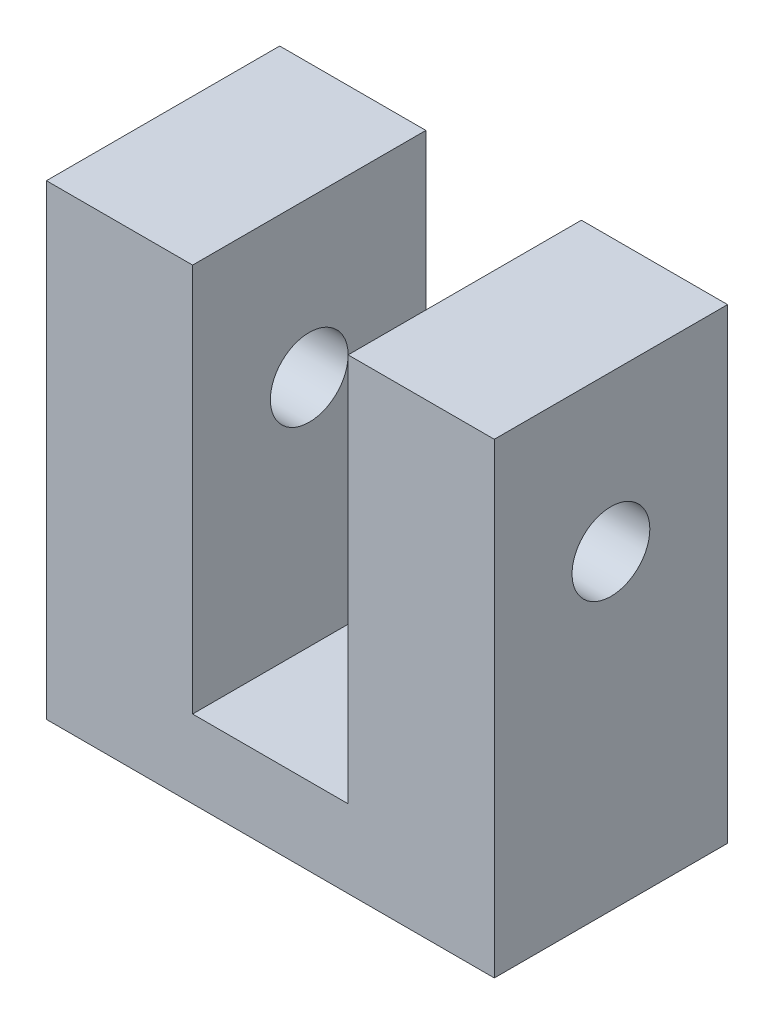
ISO-10303-21;
HEADER;
FILE_DESCRIPTION(('STEP AP214'),'2;1');
FILE_NAME('part.step','',(''),(''),'','','');
FILE_SCHEMA(('AUTOMOTIVE_DESIGN { 1 0 10303 214 1 1 1 1 }'));
ENDSEC;
DATA;
#1=APPLICATION_CONTEXT('core data for automotive mechanical design processes');
#2=APPLICATION_PROTOCOL_DEFINITION('international standard','automotive_design',2000,#1);
#3=PRODUCT_CONTEXT('',#1,'mechanical');
#4=PRODUCT('Part','Part','',(#3));
#5=PRODUCT_RELATED_PRODUCT_CATEGORY('part','',(#4));
#6=PRODUCT_DEFINITION_FORMATION('','',#4);
#7=PRODUCT_DEFINITION_CONTEXT('part definition',#1,'design');
#8=PRODUCT_DEFINITION('design','',#6,#7);
#9=PRODUCT_DEFINITION_SHAPE('','',#8);
#10=(LENGTH_UNIT() NAMED_UNIT(*) SI_UNIT(.MILLI.,.METRE.));
#11=(NAMED_UNIT(*) PLANE_ANGLE_UNIT() SI_UNIT($,.RADIAN.));
#12=(NAMED_UNIT(*) SI_UNIT($,.STERADIAN.) SOLID_ANGLE_UNIT());
#13=UNCERTAINTY_MEASURE_WITH_UNIT(LENGTH_MEASURE(1.E-05),#10,'distance_accuracy_value','');
#14=(GEOMETRIC_REPRESENTATION_CONTEXT(3) GLOBAL_UNCERTAINTY_ASSIGNED_CONTEXT((#13)) GLOBAL_UNIT_ASSIGNED_CONTEXT((#10,
#11,#12)) REPRESENTATION_CONTEXT('',''));
#15=CARTESIAN_POINT('',(0.,0.,0.));
#16=DIRECTION('',(0.,0.,1.));
#17=DIRECTION('',(1.,0.,0.));
#18=AXIS2_PLACEMENT_3D('',#15,#16,#17);
#19=CARTESIAN_POINT('',(-18.288,0.,9.525));
#20=DIRECTION('',(0.,1.,0.));
#21=DIRECTION('',(0.,0.,1.));
#22=AXIS2_PLACEMENT_3D('',#19,#20,#21);
#23=PLANE('',#22);
#24=CARTESIAN_POINT('',(13.208,0.,3.175));
#25=DIRECTION('',(0.,-1.,0.));
#26=DIRECTION('',(0.,0.,-1.));
#27=AXIS2_PLACEMENT_3D('',#24,#25,#26);
#28=CIRCLE('',#27,3.17500000000001);
#29=CARTESIAN_POINT('',(13.208,0.,0.));
#30=VERTEX_POINT('',#29);
#31=EDGE_CURVE('E240',#30,#30,#28,.T.);
#32=ORIENTED_EDGE('',*,*,#31,.F.);
#33=EDGE_LOOP('',(#32));
#34=FACE_BOUND('',#33,.T.);
#35=CARTESIAN_POINT('',(-12.192,0.,3.175));
#36=DIRECTION('',(0.,-1.,0.));
#37=DIRECTION('',(0.,0.,-1.));
#38=AXIS2_PLACEMENT_3D('',#35,#36,#37);
#39=CIRCLE('',#38,3.17500000000001);
#40=CARTESIAN_POINT('',(-12.192,0.,0.));
#41=VERTEX_POINT('',#40);
#42=EDGE_CURVE('E232',#41,#41,#39,.T.);
#43=ORIENTED_EDGE('',*,*,#42,.F.);
#44=EDGE_LOOP('',(#43));
#45=FACE_BOUND('',#44,.T.);
#46=DIRECTION('',(1.,0.,0.));
#47=VECTOR('',#46,1.);
#48=CARTESIAN_POINT('',(-18.288,0.,-9.525));
#49=LINE('',#48,#47);
#50=CARTESIAN_POINT('',(-18.288,0.,-9.525));
#51=VERTEX_POINT('',#50);
#52=CARTESIAN_POINT('',(18.288,0.,-9.525));
#53=VERTEX_POINT('',#52);
#54=EDGE_CURVE('E146',#51,#53,#49,.T.);
#55=ORIENTED_EDGE('',*,*,#54,.T.);
#56=DIRECTION('',(0.,0.,-1.));
#57=VECTOR('',#56,1.);
#58=CARTESIAN_POINT('',(18.288,0.,9.525));
#59=LINE('',#58,#57);
#60=CARTESIAN_POINT('',(18.288,0.,9.525));
#61=VERTEX_POINT('',#60);
#62=EDGE_CURVE('E11',#61,#53,#59,.T.);
#63=ORIENTED_EDGE('',*,*,#62,.F.);
#64=DIRECTION('',(1.,0.,0.));
#65=VECTOR('',#64,1.);
#66=CARTESIAN_POINT('',(-18.288,0.,9.525));
#67=LINE('',#66,#65);
#68=CARTESIAN_POINT('',(-18.288,0.,9.525));
#69=VERTEX_POINT('',#68);
#70=EDGE_CURVE('E169',#69,#61,#67,.T.);
#71=ORIENTED_EDGE('',*,*,#70,.F.);
#72=DIRECTION('',(0.,0.,-1.));
#73=VECTOR('',#72,1.);
#74=CARTESIAN_POINT('',(-18.288,0.,9.525));
#75=LINE('',#74,#73);
#76=EDGE_CURVE('E142',#69,#51,#75,.T.);
#77=ORIENTED_EDGE('',*,*,#76,.T.);
#78=EDGE_LOOP('',(#55,#63,#71,#77));
#79=FACE_BOUND('',#78,.T.);
#80=ADVANCED_FACE('F45',(#34,#45,#79),#23,.F.);
#81=CARTESIAN_POINT('',(18.288,0.,9.525));
#82=DIRECTION('',(-1.,0.,0.));
#83=DIRECTION('',(0.,0.,1.));
#84=AXIS2_PLACEMENT_3D('',#81,#82,#83);
#85=PLANE('',#84);
#86=CARTESIAN_POINT('',(18.288,25.4,0.));
#87=DIRECTION('',(1.,0.,0.));
#88=DIRECTION('',(0.,0.,-1.));
#89=AXIS2_PLACEMENT_3D('',#86,#87,#88);
#90=CIRCLE('',#89,3.17500000000001);
#91=CARTESIAN_POINT('',(18.288,25.4,-3.17500000000001));
#92=VERTEX_POINT('',#91);
#93=EDGE_CURVE('E224',#92,#92,#90,.T.);
#94=ORIENTED_EDGE('',*,*,#93,.F.);
#95=EDGE_LOOP('',(#94));
#96=FACE_BOUND('',#95,.T.);
#97=DIRECTION('',(0.,1.,0.));
#98=VECTOR('',#97,1.);
#99=CARTESIAN_POINT('',(18.288,0.,-9.525));
#100=LINE('',#99,#98);
#101=CARTESIAN_POINT('',(18.288,38.1,-9.525));
#102=VERTEX_POINT('',#101);
#103=EDGE_CURVE('E150',#53,#102,#100,.T.);
#104=ORIENTED_EDGE('',*,*,#103,.T.);
#105=DIRECTION('',(0.,0.,-1.));
#106=VECTOR('',#105,1.);
#107=CARTESIAN_POINT('',(18.288,38.1,9.525));
#108=LINE('',#107,#106);
#109=CARTESIAN_POINT('',(18.288,38.1,9.525));
#110=VERTEX_POINT('',#109);
#111=EDGE_CURVE('E54',#110,#102,#108,.T.);
#112=ORIENTED_EDGE('',*,*,#111,.F.);
#113=DIRECTION('',(0.,1.,0.));
#114=VECTOR('',#113,1.);
#115=CARTESIAN_POINT('',(18.288,0.,9.525));
#116=LINE('',#115,#114);
#117=EDGE_CURVE('E105',#61,#110,#116,.T.);
#118=ORIENTED_EDGE('',*,*,#117,.F.);
#119=ORIENTED_EDGE('',*,*,#62,.T.);
#120=EDGE_LOOP('',(#104,#112,#118,#119));
#121=FACE_BOUND('',#120,.T.);
#122=ADVANCED_FACE('F249',(#96,#121),#85,.F.);
#123=CARTESIAN_POINT('',(18.288,38.1,9.525));
#124=DIRECTION('',(0.,-1.,0.));
#125=DIRECTION('',(0.,0.,-1.));
#126=AXIS2_PLACEMENT_3D('',#123,#124,#125);
#127=PLANE('',#126);
#128=DIRECTION('',(-1.,0.,0.));
#129=VECTOR('',#128,1.);
#130=CARTESIAN_POINT('',(18.288,38.1,-9.525));
#131=LINE('',#130,#129);
#132=CARTESIAN_POINT('',(6.35,38.1,-9.525));
#133=VERTEX_POINT('',#132);
#134=EDGE_CURVE('E154',#102,#133,#131,.T.);
#135=ORIENTED_EDGE('',*,*,#134,.T.);
#136=DIRECTION('',(0.,0.,-1.));
#137=VECTOR('',#136,1.);
#138=CARTESIAN_POINT('',(6.35,38.1,9.525));
#139=LINE('',#138,#137);
#140=CARTESIAN_POINT('',(6.35,38.1,9.525));
#141=VERTEX_POINT('',#140);
#142=EDGE_CURVE('E180',#141,#133,#139,.T.);
#143=ORIENTED_EDGE('',*,*,#142,.F.);
#144=DIRECTION('',(-1.,0.,0.));
#145=VECTOR('',#144,1.);
#146=CARTESIAN_POINT('',(18.288,38.1,9.525));
#147=LINE('',#146,#145);
#148=EDGE_CURVE('E190',#110,#141,#147,.T.);
#149=ORIENTED_EDGE('',*,*,#148,.F.);
#150=ORIENTED_EDGE('',*,*,#111,.T.);
#151=EDGE_LOOP('',(#135,#143,#149,#150));
#152=FACE_BOUND('',#151,.T.);
#153=ADVANCED_FACE('F188',(#152),#127,.F.);
#154=CARTESIAN_POINT('',(6.35,38.1,9.525));
#155=DIRECTION('',(1.,0.,0.));
#156=DIRECTION('',(0.,1.,0.));
#157=AXIS2_PLACEMENT_3D('',#154,#155,#156);
#158=PLANE('',#157);
#159=CARTESIAN_POINT('',(6.35,25.4,0.));
#160=DIRECTION('',(1.,0.,0.));
#161=DIRECTION('',(0.,1.,0.));
#162=AXIS2_PLACEMENT_3D('',#159,#160,#161);
#163=CIRCLE('',#162,3.17500000000001);
#164=CARTESIAN_POINT('',(6.35,28.575,0.));
#165=VERTEX_POINT('',#164);
#166=EDGE_CURVE('E151',#165,#165,#163,.T.);
#167=ORIENTED_EDGE('',*,*,#166,.T.);
#168=EDGE_LOOP('',(#167));
#169=FACE_BOUND('',#168,.T.);
#170=DIRECTION('',(0.,-1.,0.));
#171=VECTOR('',#170,1.);
#172=CARTESIAN_POINT('',(6.35,38.1,-9.525));
#173=LINE('',#172,#171);
#174=CARTESIAN_POINT('',(6.35,6.34999999999999,-9.525));
#175=VERTEX_POINT('',#174);
#176=EDGE_CURVE('E157',#133,#175,#173,.T.);
#177=ORIENTED_EDGE('',*,*,#176,.T.);
#178=DIRECTION('',(0.,0.,-1.));
#179=VECTOR('',#178,1.);
#180=CARTESIAN_POINT('',(6.35,6.34999999999999,9.525));
#181=LINE('',#180,#179);
#182=CARTESIAN_POINT('',(6.35,6.34999999999999,9.525));
#183=VERTEX_POINT('',#182);
#184=EDGE_CURVE('E176',#183,#175,#181,.T.);
#185=ORIENTED_EDGE('',*,*,#184,.F.);
#186=DIRECTION('',(0.,-1.,0.));
#187=VECTOR('',#186,1.);
#188=CARTESIAN_POINT('',(6.35,38.1,9.525));
#189=LINE('',#188,#187);
#190=EDGE_CURVE('E203',#141,#183,#189,.T.);
#191=ORIENTED_EDGE('',*,*,#190,.F.);
#192=ORIENTED_EDGE('',*,*,#142,.T.);
#193=EDGE_LOOP('',(#177,#185,#191,#192));
#194=FACE_BOUND('',#193,.T.);
#195=ADVANCED_FACE('F198',(#169,#194),#158,.F.);
#196=CARTESIAN_POINT('',(-6.35,6.34999999999999,9.525));
#197=DIRECTION('',(0.,-1.,0.));
#198=DIRECTION('',(0.,0.,-1.));
#199=AXIS2_PLACEMENT_3D('',#196,#197,#198);
#200=PLANE('',#199);
#201=DIRECTION('',(-1.,0.,0.));
#202=VECTOR('',#201,1.);
#203=CARTESIAN_POINT('',(-6.35,6.34999999999999,-9.525));
#204=LINE('',#203,#202);
#205=CARTESIAN_POINT('',(-6.35,6.34999999999999,-9.525));
#206=VERTEX_POINT('',#205);
#207=EDGE_CURVE('E160',#175,#206,#204,.T.);
#208=ORIENTED_EDGE('',*,*,#207,.T.);
#209=DIRECTION('',(0.,0.,-1.));
#210=VECTOR('',#209,1.);
#211=CARTESIAN_POINT('',(-6.35,6.34999999999999,9.525));
#212=LINE('',#211,#210);
#213=CARTESIAN_POINT('',(-6.35,6.34999999999999,9.525));
#214=VERTEX_POINT('',#213);
#215=EDGE_CURVE('E135',#214,#206,#212,.T.);
#216=ORIENTED_EDGE('',*,*,#215,.F.);
#217=DIRECTION('',(-1.,0.,0.));
#218=VECTOR('',#217,1.);
#219=CARTESIAN_POINT('',(-6.35,6.34999999999999,9.525));
#220=LINE('',#219,#218);
#221=EDGE_CURVE('E124',#183,#214,#220,.T.);
#222=ORIENTED_EDGE('',*,*,#221,.F.);
#223=ORIENTED_EDGE('',*,*,#184,.T.);
#224=EDGE_LOOP('',(#208,#216,#222,#223));
#225=FACE_BOUND('',#224,.T.);
#226=ADVANCED_FACE('F201',(#225),#200,.F.);
#227=CARTESIAN_POINT('',(-6.35,38.1,9.525));
#228=DIRECTION('',(-1.,0.,0.));
#229=DIRECTION('',(0.,-1.,0.));
#230=AXIS2_PLACEMENT_3D('',#227,#228,#229);
#231=PLANE('',#230);
#232=CARTESIAN_POINT('',(-6.35,25.4,0.));
#233=DIRECTION('',(-1.,0.,0.));
#234=DIRECTION('',(0.,-1.,0.));
#235=AXIS2_PLACEMENT_3D('',#232,#233,#234);
#236=CIRCLE('',#235,3.17500000000001);
#237=CARTESIAN_POINT('',(-6.35,22.225,0.));
#238=VERTEX_POINT('',#237);
#239=EDGE_CURVE('E216',#238,#238,#236,.T.);
#240=ORIENTED_EDGE('',*,*,#239,.T.);
#241=EDGE_LOOP('',(#240));
#242=FACE_BOUND('',#241,.T.);
#243=DIRECTION('',(0.,1.,0.));
#244=VECTOR('',#243,1.);
#245=CARTESIAN_POINT('',(-6.35,38.1,-9.525));
#246=LINE('',#245,#244);
#247=CARTESIAN_POINT('',(-6.35,38.1,-9.525));
#248=VERTEX_POINT('',#247);
#249=EDGE_CURVE('E133',#206,#248,#246,.T.);
#250=ORIENTED_EDGE('',*,*,#249,.T.);
#251=DIRECTION('',(0.,0.,-1.));
#252=VECTOR('',#251,1.);
#253=CARTESIAN_POINT('',(-6.35,38.1,9.525));
#254=LINE('',#253,#252);
#255=CARTESIAN_POINT('',(-6.35,38.1,9.525));
#256=VERTEX_POINT('',#255);
#257=EDGE_CURVE('E130',#256,#248,#254,.T.);
#258=ORIENTED_EDGE('',*,*,#257,.F.);
#259=DIRECTION('',(0.,1.,0.));
#260=VECTOR('',#259,1.);
#261=CARTESIAN_POINT('',(-6.35,38.1,9.525));
#262=LINE('',#261,#260);
#263=EDGE_CURVE('E118',#214,#256,#262,.T.);
#264=ORIENTED_EDGE('',*,*,#263,.F.);
#265=ORIENTED_EDGE('',*,*,#215,.T.);
#266=EDGE_LOOP('',(#250,#258,#264,#265));
#267=FACE_BOUND('',#266,.T.);
#268=ADVANCED_FACE('F131',(#242,#267),#231,.F.);
#269=CARTESIAN_POINT('',(-18.288,38.1,9.525));
#270=DIRECTION('',(0.,-1.,0.));
#271=DIRECTION('',(0.,0.,-1.));
#272=AXIS2_PLACEMENT_3D('',#269,#270,#271);
#273=PLANE('',#272);
#274=DIRECTION('',(-1.,0.,0.));
#275=VECTOR('',#274,1.);
#276=CARTESIAN_POINT('',(-18.288,38.1,-9.525));
#277=LINE('',#276,#275);
#278=CARTESIAN_POINT('',(-18.288,38.1,-9.525));
#279=VERTEX_POINT('',#278);
#280=EDGE_CURVE('E91',#248,#279,#277,.T.);
#281=ORIENTED_EDGE('',*,*,#280,.T.);
#282=DIRECTION('',(0.,0.,-1.));
#283=VECTOR('',#282,1.);
#284=CARTESIAN_POINT('',(-18.288,38.1,9.525));
#285=LINE('',#284,#283);
#286=CARTESIAN_POINT('',(-18.288,38.1,9.525));
#287=VERTEX_POINT('',#286);
#288=EDGE_CURVE('E136',#287,#279,#285,.T.);
#289=ORIENTED_EDGE('',*,*,#288,.F.);
#290=DIRECTION('',(-1.,0.,0.));
#291=VECTOR('',#290,1.);
#292=CARTESIAN_POINT('',(-18.288,38.1,9.525));
#293=LINE('',#292,#291);
#294=EDGE_CURVE('E122',#256,#287,#293,.T.);
#295=ORIENTED_EDGE('',*,*,#294,.F.);
#296=ORIENTED_EDGE('',*,*,#257,.T.);
#297=EDGE_LOOP('',(#281,#289,#295,#296));
#298=FACE_BOUND('',#297,.T.);
#299=ADVANCED_FACE('F138',(#298),#273,.F.);
#300=CARTESIAN_POINT('',(-18.288,0.,9.525));
#301=DIRECTION('',(1.,0.,0.));
#302=DIRECTION('',(0.,0.,-1.));
#303=AXIS2_PLACEMENT_3D('',#300,#301,#302);
#304=PLANE('',#303);
#305=CARTESIAN_POINT('',(-18.288,25.4,0.));
#306=DIRECTION('',(1.,0.,0.));
#307=DIRECTION('',(0.,0.,-1.));
#308=AXIS2_PLACEMENT_3D('',#305,#306,#307);
#309=CIRCLE('',#308,3.17500000000001);
#310=CARTESIAN_POINT('',(-18.288,25.4,-3.17500000000001));
#311=VERTEX_POINT('',#310);
#312=EDGE_CURVE('E220',#311,#311,#309,.T.);
#313=ORIENTED_EDGE('',*,*,#312,.T.);
#314=EDGE_LOOP('',(#313));
#315=FACE_BOUND('',#314,.T.);
#316=DIRECTION('',(0.,-1.,0.));
#317=VECTOR('',#316,1.);
#318=CARTESIAN_POINT('',(-18.288,0.,-9.525));
#319=LINE('',#318,#317);
#320=EDGE_CURVE('E97',#279,#51,#319,.T.);
#321=ORIENTED_EDGE('',*,*,#320,.T.);
#322=ORIENTED_EDGE('',*,*,#76,.F.);
#323=DIRECTION('',(0.,-1.,0.));
#324=VECTOR('',#323,1.);
#325=CARTESIAN_POINT('',(-18.288,0.,9.525));
#326=LINE('',#325,#324);
#327=EDGE_CURVE('E62',#287,#69,#326,.T.);
#328=ORIENTED_EDGE('',*,*,#327,.F.);
#329=ORIENTED_EDGE('',*,*,#288,.T.);
#330=EDGE_LOOP('',(#321,#322,#328,#329));
#331=FACE_BOUND('',#330,.T.);
#332=ADVANCED_FACE('F254',(#315,#331),#304,.F.);
#333=CARTESIAN_POINT('',(0.,0.,9.525));
#334=DIRECTION('',(0.,0.,1.));
#335=DIRECTION('',(1.,0.,0.));
#336=AXIS2_PLACEMENT_3D('',#333,#334,#335);
#337=PLANE('',#336);
#338=ORIENTED_EDGE('',*,*,#70,.T.);
#339=ORIENTED_EDGE('',*,*,#117,.T.);
#340=ORIENTED_EDGE('',*,*,#148,.T.);
#341=ORIENTED_EDGE('',*,*,#190,.T.);
#342=ORIENTED_EDGE('',*,*,#221,.T.);
#343=ORIENTED_EDGE('',*,*,#263,.T.);
#344=ORIENTED_EDGE('',*,*,#294,.T.);
#345=ORIENTED_EDGE('',*,*,#327,.T.);
#346=EDGE_LOOP('',(#338,#339,#340,#341,#342,#343,#344,#345));
#347=FACE_BOUND('',#346,.T.);
#348=ADVANCED_FACE('F120',(#347),#337,.T.);
#349=CARTESIAN_POINT('',(0.,0.,-9.525));
#350=DIRECTION('',(0.,0.,1.));
#351=DIRECTION('',(1.,0.,0.));
#352=AXIS2_PLACEMENT_3D('',#349,#350,#351);
#353=PLANE('',#352);
#354=ORIENTED_EDGE('',*,*,#54,.F.);
#355=ORIENTED_EDGE('',*,*,#320,.F.);
#356=ORIENTED_EDGE('',*,*,#280,.F.);
#357=ORIENTED_EDGE('',*,*,#249,.F.);
#358=ORIENTED_EDGE('',*,*,#207,.F.);
#359=ORIENTED_EDGE('',*,*,#176,.F.);
#360=ORIENTED_EDGE('',*,*,#134,.F.);
#361=ORIENTED_EDGE('',*,*,#103,.F.);
#362=EDGE_LOOP('',(#354,#355,#356,#357,#358,#359,#360,#361));
#363=FACE_BOUND('',#362,.T.);
#364=ADVANCED_FACE('F194',(#363),#353,.F.);
#365=CARTESIAN_POINT('',(18.288,25.4,0.));
#366=DIRECTION('',(1.,0.,0.));
#367=DIRECTION('',(0.,0.,-1.));
#368=AXIS2_PLACEMENT_3D('',#365,#366,#367);
#369=CYLINDRICAL_SURFACE('',#368,3.17500000000001);
#370=ORIENTED_EDGE('',*,*,#93,.T.);
#371=EDGE_LOOP('',(#370));
#372=FACE_BOUND('',#371,.T.);
#373=ORIENTED_EDGE('',*,*,#166,.F.);
#374=EDGE_LOOP('',(#373));
#375=FACE_BOUND('',#374,.T.);
#376=ADVANCED_FACE('F283',(#372,#375),#369,.F.);
#377=ORIENTED_EDGE('',*,*,#312,.F.);
#378=EDGE_LOOP('',(#377));
#379=FACE_BOUND('',#378,.T.);
#380=ORIENTED_EDGE('',*,*,#239,.F.);
#381=EDGE_LOOP('',(#380));
#382=FACE_BOUND('',#381,.T.);
#383=ADVANCED_FACE('F285',(#379,#382),#369,.F.);
#384=CARTESIAN_POINT('',(-12.192,12.7,3.175));
#385=DIRECTION('',(0.,1.,0.));
#386=DIRECTION('',(0.,0.,1.));
#387=AXIS2_PLACEMENT_3D('',#384,#385,#386);
#388=PLANE('',#387);
#389=CARTESIAN_POINT('',(-12.192,12.7,3.175));
#390=DIRECTION('',(0.,-1.,0.));
#391=DIRECTION('',(0.,0.,-1.));
#392=AXIS2_PLACEMENT_3D('',#389,#390,#391);
#393=CIRCLE('',#392,3.17500000000001);
#394=CARTESIAN_POINT('',(-12.192,12.7,0.));
#395=VERTEX_POINT('',#394);
#396=EDGE_CURVE('E228',#395,#395,#393,.T.);
#397=ORIENTED_EDGE('',*,*,#396,.T.);
#398=EDGE_LOOP('',(#397));
#399=FACE_BOUND('',#398,.T.);
#400=ADVANCED_FACE('F291',(#399),#388,.F.);
#401=CARTESIAN_POINT('',(-12.192,0.,3.175));
#402=DIRECTION('',(0.,-1.,0.));
#403=DIRECTION('',(0.,0.,-1.));
#404=AXIS2_PLACEMENT_3D('',#401,#402,#403);
#405=CYLINDRICAL_SURFACE('',#404,3.17500000000001);
#406=ORIENTED_EDGE('',*,*,#396,.F.);
#407=EDGE_LOOP('',(#406));
#408=FACE_BOUND('',#407,.T.);
#409=ORIENTED_EDGE('',*,*,#42,.T.);
#410=EDGE_LOOP('',(#409));
#411=FACE_BOUND('',#410,.T.);
#412=ADVANCED_FACE('F296',(#408,#411),#405,.F.);
#413=CARTESIAN_POINT('',(13.208,12.7,3.175));
#414=DIRECTION('',(0.,1.,0.));
#415=DIRECTION('',(0.,0.,1.));
#416=AXIS2_PLACEMENT_3D('',#413,#414,#415);
#417=PLANE('',#416);
#418=CARTESIAN_POINT('',(13.208,12.7,3.175));
#419=DIRECTION('',(0.,-1.,0.));
#420=DIRECTION('',(0.,0.,-1.));
#421=AXIS2_PLACEMENT_3D('',#418,#419,#420);
#422=CIRCLE('',#421,3.17500000000001);
#423=CARTESIAN_POINT('',(13.208,12.7,0.));
#424=VERTEX_POINT('',#423);
#425=EDGE_CURVE('E236',#424,#424,#422,.T.);
#426=ORIENTED_EDGE('',*,*,#425,.T.);
#427=EDGE_LOOP('',(#426));
#428=FACE_BOUND('',#427,.T.);
#429=ADVANCED_FACE('F300',(#428),#417,.F.);
#430=CARTESIAN_POINT('',(13.208,0.,3.175));
#431=DIRECTION('',(0.,-1.,0.));
#432=DIRECTION('',(0.,0.,-1.));
#433=AXIS2_PLACEMENT_3D('',#430,#431,#432);
#434=CYLINDRICAL_SURFACE('',#433,3.17500000000001);
#435=ORIENTED_EDGE('',*,*,#425,.F.);
#436=EDGE_LOOP('',(#435));
#437=FACE_BOUND('',#436,.T.);
#438=ORIENTED_EDGE('',*,*,#31,.T.);
#439=EDGE_LOOP('',(#438));
#440=FACE_BOUND('',#439,.T.);
#441=ADVANCED_FACE('F245',(#437,#440),#434,.F.);
#442=CLOSED_SHELL('',(#80,#122,#153,#195,#226,#268,#299,#332,#348,#364,#376,#383,#400,#412,#429,#441));
#443=MANIFOLD_SOLID_BREP('B2',#442);
#444=ADVANCED_BREP_SHAPE_REPRESENTATION('',(#18,#443),#14);
#445=SHAPE_DEFINITION_REPRESENTATION(#9,#444);
ENDSEC;
END-ISO-10303-21;
